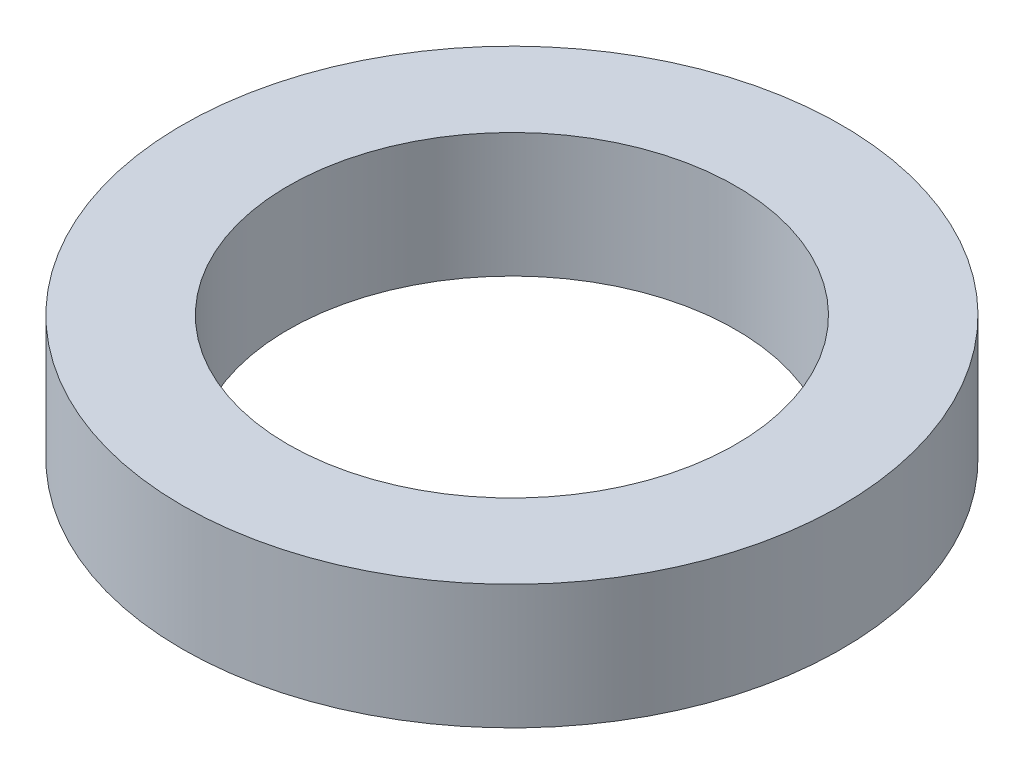
ISO-10303-21;
HEADER;
FILE_DESCRIPTION(('STEP AP214'),'2;1');
FILE_NAME('part.step','',(''),(''),'','','');
FILE_SCHEMA(('AUTOMOTIVE_DESIGN { 1 0 10303 214 1 1 1 1 }'));
ENDSEC;
DATA;
#1=APPLICATION_CONTEXT('core data for automotive mechanical design processes');
#2=APPLICATION_PROTOCOL_DEFINITION('international standard','automotive_design',2000,#1);
#3=PRODUCT_CONTEXT('',#1,'mechanical');
#4=PRODUCT('Part','Part','',(#3));
#5=PRODUCT_RELATED_PRODUCT_CATEGORY('part','',(#4));
#6=PRODUCT_DEFINITION_FORMATION('','',#4);
#7=PRODUCT_DEFINITION_CONTEXT('part definition',#1,'design');
#8=PRODUCT_DEFINITION('design','',#6,#7);
#9=PRODUCT_DEFINITION_SHAPE('','',#8);
#10=(LENGTH_UNIT() NAMED_UNIT(*) SI_UNIT(.MILLI.,.METRE.));
#11=(NAMED_UNIT(*) PLANE_ANGLE_UNIT() SI_UNIT($,.RADIAN.));
#12=(NAMED_UNIT(*) SI_UNIT($,.STERADIAN.) SOLID_ANGLE_UNIT());
#13=UNCERTAINTY_MEASURE_WITH_UNIT(LENGTH_MEASURE(1.E-05),#10,'distance_accuracy_value','');
#14=(GEOMETRIC_REPRESENTATION_CONTEXT(3) GLOBAL_UNCERTAINTY_ASSIGNED_CONTEXT((#13)) GLOBAL_UNIT_ASSIGNED_CONTEXT((#10,
#11,#12)) REPRESENTATION_CONTEXT('',''));
#15=CARTESIAN_POINT('',(0.,0.,0.));
#16=DIRECTION('',(0.,0.,1.));
#17=DIRECTION('',(1.,0.,0.));
#18=AXIS2_PLACEMENT_3D('',#15,#16,#17);
#19=CARTESIAN_POINT('',(0.,2.54,0.));
#20=DIRECTION('',(0.,1.,0.));
#21=DIRECTION('',(0.,0.,1.));
#22=AXIS2_PLACEMENT_3D('',#19,#20,#21);
#23=PLANE('',#22);
#24=CARTESIAN_POINT('',(0.,2.54,0.));
#25=DIRECTION('',(0.,1.,0.));
#26=DIRECTION('',(0.,0.,1.));
#27=AXIS2_PLACEMENT_3D('',#24,#25,#26);
#28=CIRCLE('',#27,6.731);
#29=CARTESIAN_POINT('',(0.,2.54,6.731));
#30=VERTEX_POINT('',#29);
#31=EDGE_CURVE('E10',#30,#30,#28,.T.);
#32=ORIENTED_EDGE('',*,*,#31,.T.);
#33=EDGE_LOOP('',(#32));
#34=FACE_BOUND('',#33,.T.);
#35=CARTESIAN_POINT('',(0.,2.54,0.));
#36=DIRECTION('',(0.,1.,0.));
#37=DIRECTION('',(0.,0.,1.));
#38=AXIS2_PLACEMENT_3D('',#35,#36,#37);
#39=CIRCLE('',#38,4.572);
#40=CARTESIAN_POINT('',(0.,2.54,4.572));
#41=VERTEX_POINT('',#40);
#42=EDGE_CURVE('E42',#41,#41,#39,.T.);
#43=ORIENTED_EDGE('',*,*,#42,.F.);
#44=EDGE_LOOP('',(#43));
#45=FACE_BOUND('',#44,.T.);
#46=ADVANCED_FACE('F31',(#34,#45),#23,.T.);
#47=CARTESIAN_POINT('',(0.,0.,0.));
#48=DIRECTION('',(0.,1.,0.));
#49=DIRECTION('',(0.,0.,1.));
#50=AXIS2_PLACEMENT_3D('',#47,#48,#49);
#51=PLANE('',#50);
#52=CARTESIAN_POINT('',(0.,0.,0.));
#53=DIRECTION('',(0.,1.,0.));
#54=DIRECTION('',(0.,0.,1.));
#55=AXIS2_PLACEMENT_3D('',#52,#53,#54);
#56=CIRCLE('',#55,6.731);
#57=CARTESIAN_POINT('',(0.,0.,6.731));
#58=VERTEX_POINT('',#57);
#59=EDGE_CURVE('E35',#58,#58,#56,.T.);
#60=ORIENTED_EDGE('',*,*,#59,.F.);
#61=EDGE_LOOP('',(#60));
#62=FACE_BOUND('',#61,.T.);
#63=CARTESIAN_POINT('',(0.,0.,0.));
#64=DIRECTION('',(0.,1.,0.));
#65=DIRECTION('',(0.,0.,1.));
#66=AXIS2_PLACEMENT_3D('',#63,#64,#65);
#67=CIRCLE('',#66,4.572);
#68=CARTESIAN_POINT('',(0.,0.,4.572));
#69=VERTEX_POINT('',#68);
#70=EDGE_CURVE('E44',#69,#69,#67,.T.);
#71=ORIENTED_EDGE('',*,*,#70,.T.);
#72=EDGE_LOOP('',(#71));
#73=FACE_BOUND('',#72,.T.);
#74=ADVANCED_FACE('F54',(#62,#73),#51,.F.);
#75=CARTESIAN_POINT('',(0.,2.54,0.));
#76=DIRECTION('',(0.,-1.,0.));
#77=DIRECTION('',(0.,0.,-1.));
#78=AXIS2_PLACEMENT_3D('',#75,#76,#77);
#79=CYLINDRICAL_SURFACE('',#78,6.731);
#80=ORIENTED_EDGE('',*,*,#31,.F.);
#81=EDGE_LOOP('',(#80));
#82=FACE_BOUND('',#81,.T.);
#83=ORIENTED_EDGE('',*,*,#59,.T.);
#84=EDGE_LOOP('',(#83));
#85=FACE_BOUND('',#84,.T.);
#86=ADVANCED_FACE('F33',(#82,#85),#79,.T.);
#87=CARTESIAN_POINT('',(0.,2.54,0.));
#88=DIRECTION('',(0.,-1.,0.));
#89=DIRECTION('',(0.,0.,-1.));
#90=AXIS2_PLACEMENT_3D('',#87,#88,#89);
#91=CYLINDRICAL_SURFACE('',#90,4.572);
#92=ORIENTED_EDGE('',*,*,#42,.T.);
#93=EDGE_LOOP('',(#92));
#94=FACE_BOUND('',#93,.T.);
#95=ORIENTED_EDGE('',*,*,#70,.F.);
#96=EDGE_LOOP('',(#95));
#97=FACE_BOUND('',#96,.T.);
#98=ADVANCED_FACE('F50',(#94,#97),#91,.F.);
#99=CLOSED_SHELL('',(#46,#74,#86,#98));
#100=MANIFOLD_SOLID_BREP('B2',#99);
#101=ADVANCED_BREP_SHAPE_REPRESENTATION('',(#18,#100),#14);
#102=SHAPE_DEFINITION_REPRESENTATION(#9,#101);
ENDSEC;
END-ISO-10303-21;
